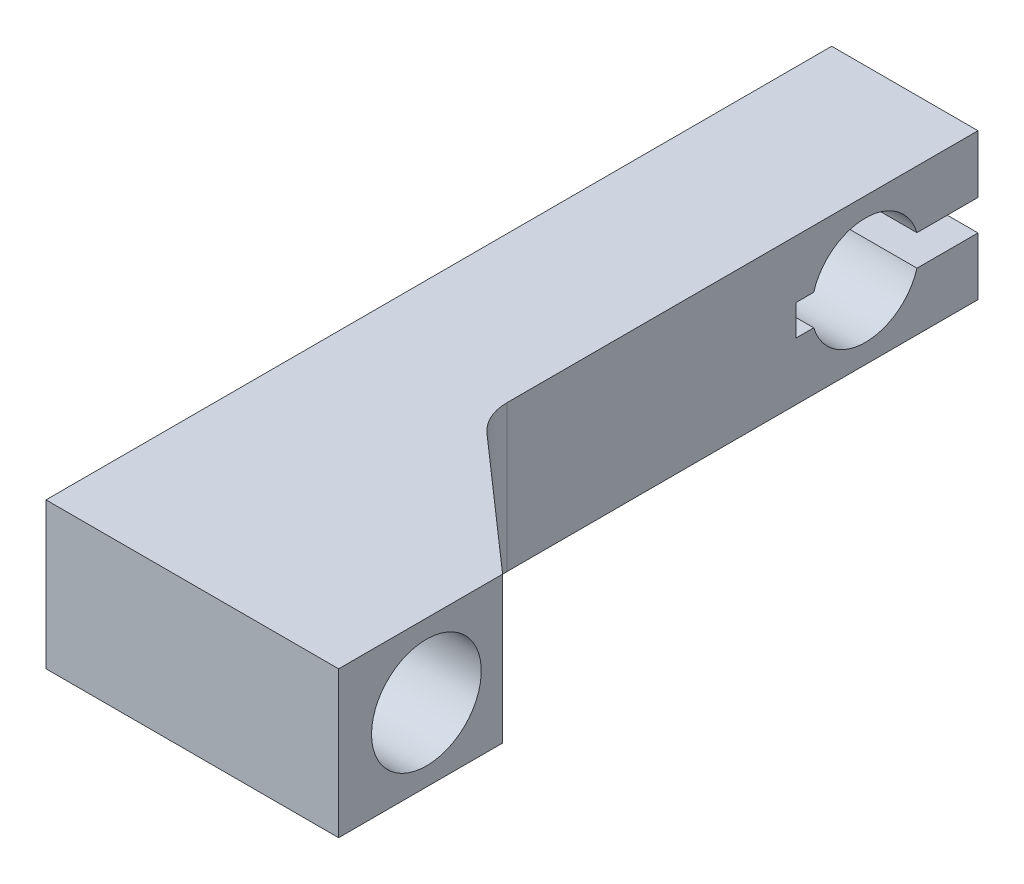
ISO-10303-21;
HEADER;
FILE_DESCRIPTION(('STEP AP214'),'2;1');
FILE_NAME('part.step','',(''),(''),'','','');
FILE_SCHEMA(('AUTOMOTIVE_DESIGN { 1 0 10303 214 1 1 1 1 }'));
ENDSEC;
DATA;
#1=APPLICATION_CONTEXT('core data for automotive mechanical design processes');
#2=APPLICATION_PROTOCOL_DEFINITION('international standard','automotive_design',2000,#1);
#3=PRODUCT_CONTEXT('',#1,'mechanical');
#4=PRODUCT('Part','Part','',(#3));
#5=PRODUCT_RELATED_PRODUCT_CATEGORY('part','',(#4));
#6=PRODUCT_DEFINITION_FORMATION('','',#4);
#7=PRODUCT_DEFINITION_CONTEXT('part definition',#1,'design');
#8=PRODUCT_DEFINITION('design','',#6,#7);
#9=PRODUCT_DEFINITION_SHAPE('','',#8);
#10=(LENGTH_UNIT() NAMED_UNIT(*) SI_UNIT(.MILLI.,.METRE.));
#11=(NAMED_UNIT(*) PLANE_ANGLE_UNIT() SI_UNIT($,.RADIAN.));
#12=(NAMED_UNIT(*) SI_UNIT($,.STERADIAN.) SOLID_ANGLE_UNIT());
#13=UNCERTAINTY_MEASURE_WITH_UNIT(LENGTH_MEASURE(1.E-05),#10,'distance_accuracy_value','');
#14=(GEOMETRIC_REPRESENTATION_CONTEXT(3) GLOBAL_UNCERTAINTY_ASSIGNED_CONTEXT((#13)) GLOBAL_UNIT_ASSIGNED_CONTEXT((#10,
#11,#12)) REPRESENTATION_CONTEXT('',''));
#15=CARTESIAN_POINT('',(0.,0.,0.));
#16=DIRECTION('',(0.,0.,1.));
#17=DIRECTION('',(1.,0.,0.));
#18=AXIS2_PLACEMENT_3D('',#15,#16,#17);
#19=CARTESIAN_POINT('',(38.1,0.,0.));
#20=DIRECTION('',(1.,0.,0.));
#21=DIRECTION('',(0.,0.,-1.));
#22=AXIS2_PLACEMENT_3D('',#19,#20,#21);
#23=PLANE('',#22);
#24=DIRECTION('',(0.,0.,1.));
#25=VECTOR('',#24,1.);
#26=CARTESIAN_POINT('',(38.1,19.05,-29.3371865019454));
#27=LINE('',#26,#25);
#28=CARTESIAN_POINT('',(38.1,19.05,-29.3371865019454));
#29=VERTEX_POINT('',#28);
#30=CARTESIAN_POINT('',(38.1,19.05,93.3120397279479));
#31=VERTEX_POINT('',#30);
#32=EDGE_CURVE('E197',#29,#31,#27,.T.);
#33=ORIENTED_EDGE('',*,*,#32,.T.);
#34=DIRECTION('',(0.,1.,0.));
#35=VECTOR('',#34,1.);
#36=CARTESIAN_POINT('',(38.1,0.,93.3120397279479));
#37=LINE('',#36,#35);
#38=CARTESIAN_POINT('',(38.1,-19.05,93.3120397279479));
#39=VERTEX_POINT('',#38);
#40=EDGE_CURVE('E62',#31,#39,#37,.F.);
#41=ORIENTED_EDGE('',*,*,#40,.T.);
#42=DIRECTION('',(0.,0.,-1.));
#43=VECTOR('',#42,1.);
#44=CARTESIAN_POINT('',(38.1,-19.05,-29.3371865019454));
#45=LINE('',#44,#43);
#46=CARTESIAN_POINT('',(38.1,-19.05,-29.3371865019454));
#47=VERTEX_POINT('',#46);
#48=EDGE_CURVE('E199',#39,#47,#45,.T.);
#49=ORIENTED_EDGE('',*,*,#48,.T.);
#50=DIRECTION('',(0.,1.,0.));
#51=VECTOR('',#50,1.);
#52=CARTESIAN_POINT('',(38.1,-19.05,-29.3371865019454));
#53=LINE('',#52,#51);
#54=CARTESIAN_POINT('',(38.1,-4.,-29.3371865019454));
#55=VERTEX_POINT('',#54);
#56=EDGE_CURVE('E201',#47,#55,#53,.T.);
#57=ORIENTED_EDGE('',*,*,#56,.T.);
#58=DIRECTION('',(0.,0.,1.));
#59=VECTOR('',#58,1.);
#60=CARTESIAN_POINT('',(38.1,-4.,-13.4424932583208));
#61=LINE('',#60,#59);
#62=CARTESIAN_POINT('',(38.1,-4.,-13.4424932583208));
#63=VERTEX_POINT('',#62);
#64=EDGE_CURVE('E203',#55,#63,#61,.T.);
#65=ORIENTED_EDGE('',*,*,#64,.T.);
#66=CARTESIAN_POINT('',(38.1,0.,0.));
#67=DIRECTION('',(-1.,0.,0.));
#68=DIRECTION('',(0.,0.,-1.));
#69=AXIS2_PLACEMENT_3D('',#66,#67,#68);
#70=CIRCLE('',#69,14.025);
#71=CARTESIAN_POINT('',(38.1,-4.,13.4424932583208));
#72=VERTEX_POINT('',#71);
#73=EDGE_CURVE('E181',#63,#72,#70,.T.);
#74=ORIENTED_EDGE('',*,*,#73,.T.);
#75=DIRECTION('',(0.,0.,1.));
#76=VECTOR('',#75,1.);
#77=CARTESIAN_POINT('',(38.1,-4.,18.025));
#78=LINE('',#77,#76);
#79=CARTESIAN_POINT('',(38.1,-4.,18.025));
#80=VERTEX_POINT('',#79);
#81=EDGE_CURVE('E184',#72,#80,#78,.T.);
#82=ORIENTED_EDGE('',*,*,#81,.T.);
#83=DIRECTION('',(0.,1.,0.));
#84=VECTOR('',#83,1.);
#85=CARTESIAN_POINT('',(38.1,4.,18.025));
#86=LINE('',#85,#84);
#87=CARTESIAN_POINT('',(38.1,4.,18.025));
#88=VERTEX_POINT('',#87);
#89=EDGE_CURVE('E187',#80,#88,#86,.T.);
#90=ORIENTED_EDGE('',*,*,#89,.T.);
#91=DIRECTION('',(0.,0.,-1.));
#92=VECTOR('',#91,1.);
#93=CARTESIAN_POINT('',(38.1,4.,18.025));
#94=LINE('',#93,#92);
#95=CARTESIAN_POINT('',(38.1,4.,13.4424932583208));
#96=VERTEX_POINT('',#95);
#97=EDGE_CURVE('E189',#88,#96,#94,.T.);
#98=ORIENTED_EDGE('',*,*,#97,.T.);
#99=CARTESIAN_POINT('',(38.1,0.,0.));
#100=DIRECTION('',(-1.,0.,0.));
#101=DIRECTION('',(0.,0.,-1.));
#102=AXIS2_PLACEMENT_3D('',#99,#100,#101);
#103=CIRCLE('',#102,14.025);
#104=CARTESIAN_POINT('',(38.1,4.,-13.4424932583208));
#105=VERTEX_POINT('',#104);
#106=EDGE_CURVE('E191',#96,#105,#103,.T.);
#107=ORIENTED_EDGE('',*,*,#106,.T.);
#108=DIRECTION('',(0.,0.,-1.));
#109=VECTOR('',#108,1.);
#110=CARTESIAN_POINT('',(38.1,4.,-13.4424932583208));
#111=LINE('',#110,#109);
#112=CARTESIAN_POINT('',(38.1,4.,-29.3371865019454));
#113=VERTEX_POINT('',#112);
#114=EDGE_CURVE('E193',#105,#113,#111,.T.);
#115=ORIENTED_EDGE('',*,*,#114,.T.);
#116=DIRECTION('',(0.,1.,0.));
#117=VECTOR('',#116,1.);
#118=CARTESIAN_POINT('',(38.1,4.,-29.3371865019454));
#119=LINE('',#118,#117);
#120=EDGE_CURVE('E195',#113,#29,#119,.T.);
#121=ORIENTED_EDGE('',*,*,#120,.T.);
#122=EDGE_LOOP('',(#33,#41,#49,#57,#65,#74,#82,#90,#98,#107,#115,#121));
#123=FACE_BOUND('',#122,.T.);
#124=ADVANCED_FACE('F41',(#123),#23,.T.);
#125=CARTESIAN_POINT('',(0.,0.,0.));
#126=DIRECTION('',(1.,0.,0.));
#127=DIRECTION('',(0.,0.,-1.));
#128=AXIS2_PLACEMENT_3D('',#125,#126,#127);
#129=PLANE('',#128);
#130=CARTESIAN_POINT('',(0.,0.,0.));
#131=DIRECTION('',(-1.,0.,0.));
#132=DIRECTION('',(0.,0.,-1.));
#133=AXIS2_PLACEMENT_3D('',#130,#131,#132);
#134=CIRCLE('',#133,14.025);
#135=CARTESIAN_POINT('',(0.,-4.,-13.4424932583208));
#136=VERTEX_POINT('',#135);
#137=CARTESIAN_POINT('',(0.,-4.,13.4424932583208));
#138=VERTEX_POINT('',#137);
#139=EDGE_CURVE('E180',#136,#138,#134,.T.);
#140=ORIENTED_EDGE('',*,*,#139,.F.);
#141=DIRECTION('',(0.,0.,1.));
#142=VECTOR('',#141,1.);
#143=CARTESIAN_POINT('',(0.,-4.,-13.4424932583208));
#144=LINE('',#143,#142);
#145=CARTESIAN_POINT('',(0.,-4.,-29.3371865019454));
#146=VERTEX_POINT('',#145);
#147=EDGE_CURVE('E185',#146,#136,#144,.T.);
#148=ORIENTED_EDGE('',*,*,#147,.F.);
#149=DIRECTION('',(0.,1.,0.));
#150=VECTOR('',#149,1.);
#151=CARTESIAN_POINT('',(0.,-19.05,-29.3371865019454));
#152=LINE('',#151,#150);
#153=CARTESIAN_POINT('',(0.,-19.05,-29.3371865019454));
#154=VERTEX_POINT('',#153);
#155=EDGE_CURVE('E226',#154,#146,#152,.T.);
#156=ORIENTED_EDGE('',*,*,#155,.F.);
#157=DIRECTION('',(0.,0.,-1.));
#158=VECTOR('',#157,1.);
#159=CARTESIAN_POINT('',(0.,-19.05,-29.3371865019454));
#160=LINE('',#159,#158);
#161=CARTESIAN_POINT('',(0.,-19.05,175.255687153778));
#162=VERTEX_POINT('',#161);
#163=EDGE_CURVE('E224',#162,#154,#160,.T.);
#164=ORIENTED_EDGE('',*,*,#163,.F.);
#165=DIRECTION('',(0.,-1.,0.));
#166=VECTOR('',#165,1.);
#167=CARTESIAN_POINT('',(0.,-19.05,175.255687153778));
#168=LINE('',#167,#166);
#169=CARTESIAN_POINT('',(0.,19.05,175.255687153778));
#170=VERTEX_POINT('',#169);
#171=EDGE_CURVE('E222',#170,#162,#168,.T.);
#172=ORIENTED_EDGE('',*,*,#171,.F.);
#173=DIRECTION('',(0.,0.,1.));
#174=VECTOR('',#173,1.);
#175=CARTESIAN_POINT('',(0.,19.05,-29.3371865019454));
#176=LINE('',#175,#174);
#177=CARTESIAN_POINT('',(0.,19.05,-29.3371865019454));
#178=VERTEX_POINT('',#177);
#179=EDGE_CURVE('E220',#178,#170,#176,.T.);
#180=ORIENTED_EDGE('',*,*,#179,.F.);
#181=DIRECTION('',(0.,1.,0.));
#182=VECTOR('',#181,1.);
#183=CARTESIAN_POINT('',(0.,4.,-29.3371865019454));
#184=LINE('',#183,#182);
#185=CARTESIAN_POINT('',(0.,4.,-29.3371865019454));
#186=VERTEX_POINT('',#185);
#187=EDGE_CURVE('E218',#186,#178,#184,.T.);
#188=ORIENTED_EDGE('',*,*,#187,.F.);
#189=DIRECTION('',(0.,0.,-1.));
#190=VECTOR('',#189,1.);
#191=CARTESIAN_POINT('',(0.,4.,-13.4424932583208));
#192=LINE('',#191,#190);
#193=CARTESIAN_POINT('',(0.,4.,-13.4424932583208));
#194=VERTEX_POINT('',#193);
#195=EDGE_CURVE('E216',#194,#186,#192,.T.);
#196=ORIENTED_EDGE('',*,*,#195,.F.);
#197=CARTESIAN_POINT('',(0.,0.,0.));
#198=DIRECTION('',(-1.,0.,0.));
#199=DIRECTION('',(0.,0.,-1.));
#200=AXIS2_PLACEMENT_3D('',#197,#198,#199);
#201=CIRCLE('',#200,14.025);
#202=CARTESIAN_POINT('',(0.,4.,13.4424932583208));
#203=VERTEX_POINT('',#202);
#204=EDGE_CURVE('E214',#203,#194,#201,.T.);
#205=ORIENTED_EDGE('',*,*,#204,.F.);
#206=DIRECTION('',(0.,0.,-1.));
#207=VECTOR('',#206,1.);
#208=CARTESIAN_POINT('',(0.,4.,18.025));
#209=LINE('',#208,#207);
#210=CARTESIAN_POINT('',(0.,4.,18.025));
#211=VERTEX_POINT('',#210);
#212=EDGE_CURVE('E212',#211,#203,#209,.T.);
#213=ORIENTED_EDGE('',*,*,#212,.F.);
#214=DIRECTION('',(0.,1.,0.));
#215=VECTOR('',#214,1.);
#216=CARTESIAN_POINT('',(0.,4.,18.025));
#217=LINE('',#216,#215);
#218=CARTESIAN_POINT('',(0.,-4.,18.025));
#219=VERTEX_POINT('',#218);
#220=EDGE_CURVE('E210',#219,#211,#217,.T.);
#221=ORIENTED_EDGE('',*,*,#220,.F.);
#222=DIRECTION('',(0.,0.,1.));
#223=VECTOR('',#222,1.);
#224=CARTESIAN_POINT('',(0.,-4.,18.025));
#225=LINE('',#224,#223);
#226=EDGE_CURVE('E208',#138,#219,#225,.T.);
#227=ORIENTED_EDGE('',*,*,#226,.F.);
#228=EDGE_LOOP('',(#140,#148,#156,#164,#172,#180,#188,#196,#205,#213,#221,#227));
#229=FACE_BOUND('',#228,.T.);
#230=CARTESIAN_POINT('',(0.,0.,152.4));
#231=DIRECTION('',(1.,0.,0.));
#232=DIRECTION('',(0.,0.,-1.));
#233=AXIS2_PLACEMENT_3D('',#230,#231,#232);
#234=CIRCLE('',#233,14.2875);
#235=CARTESIAN_POINT('',(0.,0.,166.6875));
#236=VERTEX_POINT('',#235);
#237=EDGE_CURVE('E173',#236,#236,#234,.T.);
#238=ORIENTED_EDGE('',*,*,#237,.T.);
#239=EDGE_LOOP('',(#238));
#240=FACE_BOUND('',#239,.T.);
#241=ADVANCED_FACE('F284',(#229,#240),#129,.F.);
#242=CARTESIAN_POINT('',(38.1,0.,0.));
#243=DIRECTION('',(-1.,0.,0.));
#244=DIRECTION('',(0.,0.,1.));
#245=AXIS2_PLACEMENT_3D('',#242,#243,#244);
#246=CYLINDRICAL_SURFACE('',#245,14.025);
#247=ORIENTED_EDGE('',*,*,#139,.T.);
#248=DIRECTION('',(-1.,0.,0.));
#249=VECTOR('',#248,1.);
#250=CARTESIAN_POINT('',(38.1,-4.,13.4424932583208));
#251=LINE('',#250,#249);
#252=EDGE_CURVE('E260',#72,#138,#251,.T.);
#253=ORIENTED_EDGE('',*,*,#252,.F.);
#254=ORIENTED_EDGE('',*,*,#73,.F.);
#255=DIRECTION('',(-1.,0.,0.));
#256=VECTOR('',#255,1.);
#257=CARTESIAN_POINT('',(38.1,-4.,-13.4424932583208));
#258=LINE('',#257,#256);
#259=EDGE_CURVE('E205',#63,#136,#258,.T.);
#260=ORIENTED_EDGE('',*,*,#259,.T.);
#261=EDGE_LOOP('',(#247,#253,#254,#260));
#262=FACE_BOUND('',#261,.T.);
#263=ADVANCED_FACE('F289',(#262),#246,.F.);
#264=CARTESIAN_POINT('',(38.1,-4.,18.025));
#265=DIRECTION('',(0.,-1.,0.));
#266=DIRECTION('',(0.,0.,-1.));
#267=AXIS2_PLACEMENT_3D('',#264,#265,#266);
#268=PLANE('',#267);
#269=ORIENTED_EDGE('',*,*,#226,.T.);
#270=DIRECTION('',(-1.,0.,0.));
#271=VECTOR('',#270,1.);
#272=CARTESIAN_POINT('',(38.1,-4.,18.025));
#273=LINE('',#272,#271);
#274=EDGE_CURVE('E257',#80,#219,#273,.T.);
#275=ORIENTED_EDGE('',*,*,#274,.F.);
#276=ORIENTED_EDGE('',*,*,#81,.F.);
#277=ORIENTED_EDGE('',*,*,#252,.T.);
#278=EDGE_LOOP('',(#269,#275,#276,#277));
#279=FACE_BOUND('',#278,.T.);
#280=ADVANCED_FACE('F327',(#279),#268,.F.);
#281=CARTESIAN_POINT('',(38.1,4.,18.025));
#282=DIRECTION('',(0.,0.,1.));
#283=DIRECTION('',(1.,0.,0.));
#284=AXIS2_PLACEMENT_3D('',#281,#282,#283);
#285=PLANE('',#284);
#286=ORIENTED_EDGE('',*,*,#220,.T.);
#287=DIRECTION('',(-1.,0.,0.));
#288=VECTOR('',#287,1.);
#289=CARTESIAN_POINT('',(38.1,4.,18.025));
#290=LINE('',#289,#288);
#291=EDGE_CURVE('E254',#88,#211,#290,.T.);
#292=ORIENTED_EDGE('',*,*,#291,.F.);
#293=ORIENTED_EDGE('',*,*,#89,.F.);
#294=ORIENTED_EDGE('',*,*,#274,.T.);
#295=EDGE_LOOP('',(#286,#292,#293,#294));
#296=FACE_BOUND('',#295,.T.);
#297=ADVANCED_FACE('F323',(#296),#285,.F.);
#298=CARTESIAN_POINT('',(38.1,4.,18.025));
#299=DIRECTION('',(0.,1.,0.));
#300=DIRECTION('',(0.,0.,1.));
#301=AXIS2_PLACEMENT_3D('',#298,#299,#300);
#302=PLANE('',#301);
#303=ORIENTED_EDGE('',*,*,#212,.T.);
#304=DIRECTION('',(-1.,0.,0.));
#305=VECTOR('',#304,1.);
#306=CARTESIAN_POINT('',(38.1,4.,13.4424932583208));
#307=LINE('',#306,#305);
#308=EDGE_CURVE('E251',#96,#203,#307,.T.);
#309=ORIENTED_EDGE('',*,*,#308,.F.);
#310=ORIENTED_EDGE('',*,*,#97,.F.);
#311=ORIENTED_EDGE('',*,*,#291,.T.);
#312=EDGE_LOOP('',(#303,#309,#310,#311));
#313=FACE_BOUND('',#312,.T.);
#314=ADVANCED_FACE('F319',(#313),#302,.F.);
#315=CARTESIAN_POINT('',(38.1,0.,0.));
#316=DIRECTION('',(-1.,0.,0.));
#317=DIRECTION('',(0.,0.,1.));
#318=AXIS2_PLACEMENT_3D('',#315,#316,#317);
#319=CYLINDRICAL_SURFACE('',#318,14.025);
#320=ORIENTED_EDGE('',*,*,#204,.T.);
#321=DIRECTION('',(-1.,0.,0.));
#322=VECTOR('',#321,1.);
#323=CARTESIAN_POINT('',(38.1,4.,-13.4424932583208));
#324=LINE('',#323,#322);
#325=EDGE_CURVE('E248',#105,#194,#324,.T.);
#326=ORIENTED_EDGE('',*,*,#325,.F.);
#327=ORIENTED_EDGE('',*,*,#106,.F.);
#328=ORIENTED_EDGE('',*,*,#308,.T.);
#329=EDGE_LOOP('',(#320,#326,#327,#328));
#330=FACE_BOUND('',#329,.T.);
#331=ADVANCED_FACE('F315',(#330),#319,.F.);
#332=CARTESIAN_POINT('',(38.1,4.,-13.4424932583208));
#333=DIRECTION('',(0.,1.,0.));
#334=DIRECTION('',(0.,0.,1.));
#335=AXIS2_PLACEMENT_3D('',#332,#333,#334);
#336=PLANE('',#335);
#337=ORIENTED_EDGE('',*,*,#195,.T.);
#338=DIRECTION('',(-1.,0.,0.));
#339=VECTOR('',#338,1.);
#340=CARTESIAN_POINT('',(38.1,4.,-29.3371865019454));
#341=LINE('',#340,#339);
#342=EDGE_CURVE('E245',#113,#186,#341,.T.);
#343=ORIENTED_EDGE('',*,*,#342,.F.);
#344=ORIENTED_EDGE('',*,*,#114,.F.);
#345=ORIENTED_EDGE('',*,*,#325,.T.);
#346=EDGE_LOOP('',(#337,#343,#344,#345));
#347=FACE_BOUND('',#346,.T.);
#348=ADVANCED_FACE('F311',(#347),#336,.F.);
#349=CARTESIAN_POINT('',(38.1,4.,-29.3371865019454));
#350=DIRECTION('',(0.,0.,1.));
#351=DIRECTION('',(0.,-1.,0.));
#352=AXIS2_PLACEMENT_3D('',#349,#350,#351);
#353=PLANE('',#352);
#354=ORIENTED_EDGE('',*,*,#187,.T.);
#355=DIRECTION('',(-1.,0.,0.));
#356=VECTOR('',#355,1.);
#357=CARTESIAN_POINT('',(38.1,19.05,-29.3371865019454));
#358=LINE('',#357,#356);
#359=EDGE_CURVE('E242',#29,#178,#358,.T.);
#360=ORIENTED_EDGE('',*,*,#359,.F.);
#361=ORIENTED_EDGE('',*,*,#120,.F.);
#362=ORIENTED_EDGE('',*,*,#342,.T.);
#363=EDGE_LOOP('',(#354,#360,#361,#362));
#364=FACE_BOUND('',#363,.T.);
#365=ADVANCED_FACE('F308',(#364),#353,.F.);
#366=CARTESIAN_POINT('',(38.1,19.05,-29.3371865019454));
#367=DIRECTION('',(0.,-1.,0.));
#368=DIRECTION('',(0.,0.,-1.));
#369=AXIS2_PLACEMENT_3D('',#366,#367,#368);
#370=PLANE('',#369);
#371=DIRECTION('',(0.,0.,1.));
#372=VECTOR('',#371,1.);
#373=CARTESIAN_POINT('',(76.2,19.05,175.255687153778));
#374=LINE('',#373,#372);
#375=CARTESIAN_POINT('',(76.2,19.05,132.562404593663));
#376=VERTEX_POINT('',#375);
#377=CARTESIAN_POINT('',(76.2,19.05,175.255687153778));
#378=VERTEX_POINT('',#377);
#379=EDGE_CURVE('E171',#376,#378,#374,.T.);
#380=ORIENTED_EDGE('',*,*,#379,.F.);
#381=DIRECTION('',(0.750921509037431,0.,0.660391465166644));
#382=VECTOR('',#381,1.);
#383=CARTESIAN_POINT('',(38.1,19.05,99.0556871537785));
#384=LINE('',#383,#382);
#385=CARTESIAN_POINT('',(42.4130283923836,19.05,102.848742892723));
#386=VERTEX_POINT('',#385);
#387=EDGE_CURVE('E159',#386,#376,#384,.T.);
#388=ORIENTED_EDGE('',*,*,#387,.F.);
#389=CARTESIAN_POINT('',(50.8,19.05,93.3120397279479));
#390=DIRECTION('',(0.,-1.,0.));
#391=DIRECTION('',(0.,0.,-1.));
#392=AXIS2_PLACEMENT_3D('',#389,#390,#391);
#393=CIRCLE('',#392,12.7);
#394=EDGE_CURVE('E49',#386,#31,#393,.T.);
#395=ORIENTED_EDGE('',*,*,#394,.T.);
#396=ORIENTED_EDGE('',*,*,#32,.F.);
#397=ORIENTED_EDGE('',*,*,#359,.T.);
#398=ORIENTED_EDGE('',*,*,#179,.T.);
#399=DIRECTION('',(-1.,0.,0.));
#400=VECTOR('',#399,1.);
#401=CARTESIAN_POINT('',(38.1,19.05,175.255687153778));
#402=LINE('',#401,#400);
#403=EDGE_CURVE('E239',#378,#170,#402,.T.);
#404=ORIENTED_EDGE('',*,*,#403,.F.);
#405=EDGE_LOOP('',(#380,#388,#395,#396,#397,#398,#404));
#406=FACE_BOUND('',#405,.T.);
#407=ADVANCED_FACE('F266',(#406),#370,.F.);
#408=CARTESIAN_POINT('',(38.1,-19.05,175.255687153778));
#409=DIRECTION('',(0.,0.,-1.));
#410=DIRECTION('',(-1.,0.,0.));
#411=AXIS2_PLACEMENT_3D('',#408,#409,#410);
#412=PLANE('',#411);
#413=ORIENTED_EDGE('',*,*,#171,.T.);
#414=DIRECTION('',(-1.,0.,0.));
#415=VECTOR('',#414,1.);
#416=CARTESIAN_POINT('',(38.1,-19.05,175.255687153778));
#417=LINE('',#416,#415);
#418=CARTESIAN_POINT('',(76.2,-19.05,175.255687153778));
#419=VERTEX_POINT('',#418);
#420=EDGE_CURVE('E237',#419,#162,#417,.T.);
#421=ORIENTED_EDGE('',*,*,#420,.F.);
#422=DIRECTION('',(0.,-1.,0.));
#423=VECTOR('',#422,1.);
#424=CARTESIAN_POINT('',(76.2,19.05,175.255687153778));
#425=LINE('',#424,#423);
#426=EDGE_CURVE('E170',#378,#419,#425,.T.);
#427=ORIENTED_EDGE('',*,*,#426,.F.);
#428=ORIENTED_EDGE('',*,*,#403,.T.);
#429=EDGE_LOOP('',(#413,#421,#427,#428));
#430=FACE_BOUND('',#429,.T.);
#431=ADVANCED_FACE('F302',(#430),#412,.F.);
#432=CARTESIAN_POINT('',(38.1,-19.05,-29.3371865019454));
#433=DIRECTION('',(0.,1.,0.));
#434=DIRECTION('',(0.,0.,1.));
#435=AXIS2_PLACEMENT_3D('',#432,#433,#434);
#436=PLANE('',#435);
#437=ORIENTED_EDGE('',*,*,#48,.F.);
#438=CARTESIAN_POINT('',(50.8,-19.05,93.3120397279479));
#439=DIRECTION('',(0.,1.,0.));
#440=DIRECTION('',(0.,0.,1.));
#441=AXIS2_PLACEMENT_3D('',#438,#439,#440);
#442=CIRCLE('',#441,12.7);
#443=CARTESIAN_POINT('',(42.4130283923836,-19.05,102.848742892723));
#444=VERTEX_POINT('',#443);
#445=EDGE_CURVE('E11',#39,#444,#442,.T.);
#446=ORIENTED_EDGE('',*,*,#445,.T.);
#447=DIRECTION('',(0.750921509037431,0.,0.660391465166644));
#448=VECTOR('',#447,1.);
#449=CARTESIAN_POINT('',(38.1,-19.05,99.0556871537785));
#450=LINE('',#449,#448);
#451=CARTESIAN_POINT('',(76.2,-19.05,132.562404593663));
#452=VERTEX_POINT('',#451);
#453=EDGE_CURVE('E147',#444,#452,#450,.T.);
#454=ORIENTED_EDGE('',*,*,#453,.T.);
#455=DIRECTION('',(0.,0.,-1.));
#456=VECTOR('',#455,1.);
#457=CARTESIAN_POINT('',(76.2,-19.05,175.255687153778));
#458=LINE('',#457,#456);
#459=EDGE_CURVE('E152',#419,#452,#458,.T.);
#460=ORIENTED_EDGE('',*,*,#459,.F.);
#461=ORIENTED_EDGE('',*,*,#420,.T.);
#462=ORIENTED_EDGE('',*,*,#163,.T.);
#463=DIRECTION('',(-1.,0.,0.));
#464=VECTOR('',#463,1.);
#465=CARTESIAN_POINT('',(38.1,-19.05,-29.3371865019454));
#466=LINE('',#465,#464);
#467=EDGE_CURVE('E234',#47,#154,#466,.T.);
#468=ORIENTED_EDGE('',*,*,#467,.F.);
#469=EDGE_LOOP('',(#437,#446,#454,#460,#461,#462,#468));
#470=FACE_BOUND('',#469,.T.);
#471=ADVANCED_FACE('F149',(#470),#436,.F.);
#472=CARTESIAN_POINT('',(38.1,-19.05,-29.3371865019454));
#473=DIRECTION('',(0.,0.,1.));
#474=DIRECTION('',(0.,-1.,0.));
#475=AXIS2_PLACEMENT_3D('',#472,#473,#474);
#476=PLANE('',#475);
#477=ORIENTED_EDGE('',*,*,#155,.T.);
#478=DIRECTION('',(-1.,0.,0.));
#479=VECTOR('',#478,1.);
#480=CARTESIAN_POINT('',(38.1,-4.,-29.3371865019454));
#481=LINE('',#480,#479);
#482=EDGE_CURVE('E231',#55,#146,#481,.T.);
#483=ORIENTED_EDGE('',*,*,#482,.F.);
#484=ORIENTED_EDGE('',*,*,#56,.F.);
#485=ORIENTED_EDGE('',*,*,#467,.T.);
#486=EDGE_LOOP('',(#477,#483,#484,#485));
#487=FACE_BOUND('',#486,.T.);
#488=ADVANCED_FACE('F295',(#487),#476,.F.);
#489=CARTESIAN_POINT('',(38.1,-4.,-13.4424932583208));
#490=DIRECTION('',(0.,-1.,0.));
#491=DIRECTION('',(0.,0.,-1.));
#492=AXIS2_PLACEMENT_3D('',#489,#490,#491);
#493=PLANE('',#492);
#494=ORIENTED_EDGE('',*,*,#147,.T.);
#495=ORIENTED_EDGE('',*,*,#259,.F.);
#496=ORIENTED_EDGE('',*,*,#64,.F.);
#497=ORIENTED_EDGE('',*,*,#482,.T.);
#498=EDGE_LOOP('',(#494,#495,#496,#497));
#499=FACE_BOUND('',#498,.T.);
#500=ADVANCED_FACE('F280',(#499),#493,.F.);
#501=CARTESIAN_POINT('',(38.1,0.,152.4));
#502=DIRECTION('',(-1.,0.,0.));
#503=DIRECTION('',(0.,0.,1.));
#504=AXIS2_PLACEMENT_3D('',#501,#502,#503);
#505=CYLINDRICAL_SURFACE('',#504,14.2875);
#506=CARTESIAN_POINT('',(76.2,0.,152.4));
#507=DIRECTION('',(1.,0.,0.));
#508=DIRECTION('',(0.,0.,-1.));
#509=AXIS2_PLACEMENT_3D('',#506,#507,#508);
#510=CIRCLE('',#509,14.2875);
#511=CARTESIAN_POINT('',(76.2,0.,166.6875));
#512=VERTEX_POINT('',#511);
#513=EDGE_CURVE('E165',#512,#512,#510,.T.);
#514=CARTESIAN_POINT('',(0.,0.,166.6875));
#515=CARTESIAN_POINT('',(0.793750000000001,0.,166.6875));
#516=CARTESIAN_POINT('',(1.5875,0.,166.6875));
#517=CARTESIAN_POINT('',(3.175,0.,166.6875));
#518=CARTESIAN_POINT('',(3.96875,0.,166.6875));
#519=CARTESIAN_POINT('',(5.55625,0.,166.6875));
#520=CARTESIAN_POINT('',(6.35,0.,166.6875));
#521=CARTESIAN_POINT('',(7.9375,0.,166.6875));
#522=CARTESIAN_POINT('',(8.73125,0.,166.6875));
#523=CARTESIAN_POINT('',(10.31875,0.,166.6875));
#524=CARTESIAN_POINT('',(11.1125,0.,166.6875));
#525=CARTESIAN_POINT('',(12.7,0.,166.6875));
#526=CARTESIAN_POINT('',(13.49375,0.,166.6875));
#527=CARTESIAN_POINT('',(15.08125,0.,166.6875));
#528=CARTESIAN_POINT('',(15.875,0.,166.6875));
#529=CARTESIAN_POINT('',(17.4625,0.,166.6875));
#530=CARTESIAN_POINT('',(18.25625,0.,166.6875));
#531=CARTESIAN_POINT('',(19.84375,0.,166.6875));
#532=CARTESIAN_POINT('',(20.6375,0.,166.6875));
#533=CARTESIAN_POINT('',(22.225,0.,166.6875));
#534=CARTESIAN_POINT('',(23.01875,0.,166.6875));
#535=CARTESIAN_POINT('',(24.60625,0.,166.6875));
#536=CARTESIAN_POINT('',(25.4,0.,166.6875));
#537=CARTESIAN_POINT('',(26.9875,0.,166.6875));
#538=CARTESIAN_POINT('',(27.78125,0.,166.6875));
#539=CARTESIAN_POINT('',(29.36875,0.,166.6875));
#540=CARTESIAN_POINT('',(30.1625,0.,166.6875));
#541=CARTESIAN_POINT('',(31.75,0.,166.6875));
#542=CARTESIAN_POINT('',(32.54375,0.,166.6875));
#543=CARTESIAN_POINT('',(34.13125,0.,166.6875));
#544=CARTESIAN_POINT('',(34.925,0.,166.6875));
#545=CARTESIAN_POINT('',(36.5125,0.,166.6875));
#546=CARTESIAN_POINT('',(37.30625,0.,166.6875));
#547=CARTESIAN_POINT('',(38.89375,0.,166.6875));
#548=CARTESIAN_POINT('',(39.6875,0.,166.6875));
#549=CARTESIAN_POINT('',(41.275,0.,166.6875));
#550=CARTESIAN_POINT('',(42.06875,0.,166.6875));
#551=CARTESIAN_POINT('',(43.65625,0.,166.6875));
#552=CARTESIAN_POINT('',(44.45,0.,166.6875));
#553=CARTESIAN_POINT('',(46.0375,0.,166.6875));
#554=CARTESIAN_POINT('',(46.83125,0.,166.6875));
#555=CARTESIAN_POINT('',(48.41875,0.,166.6875));
#556=CARTESIAN_POINT('',(49.2125,0.,166.6875));
#557=CARTESIAN_POINT('',(50.8,0.,166.6875));
#558=CARTESIAN_POINT('',(51.59375,0.,166.6875));
#559=CARTESIAN_POINT('',(53.18125,0.,166.6875));
#560=CARTESIAN_POINT('',(53.975,0.,166.6875));
#561=CARTESIAN_POINT('',(55.5625,0.,166.6875));
#562=CARTESIAN_POINT('',(56.35625,0.,166.6875));
#563=CARTESIAN_POINT('',(57.94375,0.,166.6875));
#564=CARTESIAN_POINT('',(58.7375,0.,166.6875));
#565=CARTESIAN_POINT('',(60.325,0.,166.6875));
#566=CARTESIAN_POINT('',(61.11875,0.,166.6875));
#567=CARTESIAN_POINT('',(62.70625,0.,166.6875));
#568=CARTESIAN_POINT('',(63.5,0.,166.6875));
#569=CARTESIAN_POINT('',(65.0875,0.,166.6875));
#570=CARTESIAN_POINT('',(65.88125,0.,166.6875));
#571=CARTESIAN_POINT('',(67.46875,0.,166.6875));
#572=CARTESIAN_POINT('',(68.2625,0.,166.6875));
#573=CARTESIAN_POINT('',(69.85,0.,166.6875));
#574=CARTESIAN_POINT('',(70.64375,0.,166.6875));
#575=CARTESIAN_POINT('',(72.23125,0.,166.6875));
#576=CARTESIAN_POINT('',(73.025,0.,166.6875));
#577=CARTESIAN_POINT('',(74.6125,0.,166.6875));
#578=CARTESIAN_POINT('',(75.40625,0.,166.6875));
#579=CARTESIAN_POINT('',(76.2,0.,166.6875));
#580=B_SPLINE_CURVE_WITH_KNOTS('',3,(#514,#515,#516,#517,#518,#519,#520,#521,#522,#523,#524,
#525,#526,#527,#528,#529,#530,#531,#532,#533,#534,#535,#536,#537,#538,#539,#540,#541,#542,#543,
#544,#545,#546,#547,#548,#549,#550,#551,#552,#553,#554,#555,#556,#557,#558,#559,#560,#561,#562,
#563,#564,#565,#566,#567,#568,#569,#570,#571,#572,#573,#574,#575,#576,#577,#578,#579),
.UNSPECIFIED.,.F.,.F.,(4,2,2,2,2,2,2,2,2,2,2,2,2,2,2,2,2,2,2,2,2,2,2,2,2,2,2,2,2,2,2,2,4),(0.,
2.38125,4.7625,7.14375,9.525,11.90625,14.2875,16.66875,19.05,21.43125,23.8125,26.19375,28.575,
30.95625,33.3375,35.71875,38.1,40.48125,42.8625,45.24375,47.625,50.00625,52.3875,54.76875,57.15,
59.53125,61.9125,64.29375,66.675,69.05625,71.4375,73.81875,76.2),.UNSPECIFIED.);
#581=EDGE_CURVE('BSEAM272',#236,#512,#580,.T.);
#582=ORIENTED_EDGE('',*,*,#237,.F.);
#583=ORIENTED_EDGE('',*,*,#513,.T.);
#584=ORIENTED_EDGE('',*,*,#581,.T.);
#585=ORIENTED_EDGE('',*,*,#581,.F.);
#586=EDGE_LOOP('',(#582,#584,#583,#585));
#587=FACE_BOUND('',#586,.T.);
#588=ADVANCED_FACE('F272',(#587),#505,.F.);
#589=CARTESIAN_POINT('',(76.2,0.,0.));
#590=DIRECTION('',(1.,0.,0.));
#591=DIRECTION('',(0.,0.,-1.));
#592=AXIS2_PLACEMENT_3D('',#589,#590,#591);
#593=PLANE('',#592);
#594=DIRECTION('',(0.,1.,0.));
#595=VECTOR('',#594,1.);
#596=CARTESIAN_POINT('',(76.2,-19.05,132.562404593663));
#597=LINE('',#596,#595);
#598=EDGE_CURVE('E158',#452,#376,#597,.T.);
#599=ORIENTED_EDGE('',*,*,#598,.T.);
#600=ORIENTED_EDGE('',*,*,#379,.T.);
#601=ORIENTED_EDGE('',*,*,#426,.T.);
#602=ORIENTED_EDGE('',*,*,#459,.T.);
#603=EDGE_LOOP('',(#599,#600,#601,#602));
#604=FACE_BOUND('',#603,.T.);
#605=ORIENTED_EDGE('',*,*,#513,.F.);
#606=EDGE_LOOP('',(#605));
#607=FACE_BOUND('',#606,.T.);
#608=ADVANCED_FACE('F167',(#604,#607),#593,.T.);
#609=CARTESIAN_POINT('',(38.1,-19.05,99.0556871537785));
#610=DIRECTION('',(-0.660391465166644,0.,0.750921509037431));
#611=DIRECTION('',(0.750921509037431,0.,0.660391465166644));
#612=AXIS2_PLACEMENT_3D('',#609,#610,#611);
#613=PLANE('',#612);
#614=ORIENTED_EDGE('',*,*,#453,.F.);
#615=DIRECTION('',(0.,1.,0.));
#616=VECTOR('',#615,1.);
#617=CARTESIAN_POINT('',(42.4130283923836,-19.05,102.848742892723));
#618=LINE('',#617,#616);
#619=EDGE_CURVE('E263',#444,#386,#618,.T.);
#620=ORIENTED_EDGE('',*,*,#619,.T.);
#621=ORIENTED_EDGE('',*,*,#387,.T.);
#622=ORIENTED_EDGE('',*,*,#598,.F.);
#623=EDGE_LOOP('',(#614,#620,#621,#622));
#624=FACE_BOUND('',#623,.T.);
#625=ADVANCED_FACE('F162',(#624),#613,.F.);
#626=CARTESIAN_POINT('',(50.8,-19.05,93.3120397279479));
#627=DIRECTION('',(0.,1.,0.));
#628=DIRECTION('',(0.,0.,1.));
#629=AXIS2_PLACEMENT_3D('',#626,#627,#628);
#630=CYLINDRICAL_SURFACE('',#629,12.7);
#631=ORIENTED_EDGE('',*,*,#445,.F.);
#632=ORIENTED_EDGE('',*,*,#40,.F.);
#633=ORIENTED_EDGE('',*,*,#394,.F.);
#634=ORIENTED_EDGE('',*,*,#619,.F.);
#635=EDGE_LOOP('',(#631,#632,#633,#634));
#636=FACE_BOUND('',#635,.T.);
#637=ADVANCED_FACE('F43',(#636),#630,.F.);
#638=CLOSED_SHELL('',(#124,#241,#263,#280,#297,#314,#331,#348,#365,#407,#431,#471,#488,#500,
#588,#608,#625,#637));
#639=MANIFOLD_SOLID_BREP('B2',#638);
#640=ADVANCED_BREP_SHAPE_REPRESENTATION('',(#18,#639),#14);
#641=SHAPE_DEFINITION_REPRESENTATION(#9,#640);
ENDSEC;
END-ISO-10303-21;
